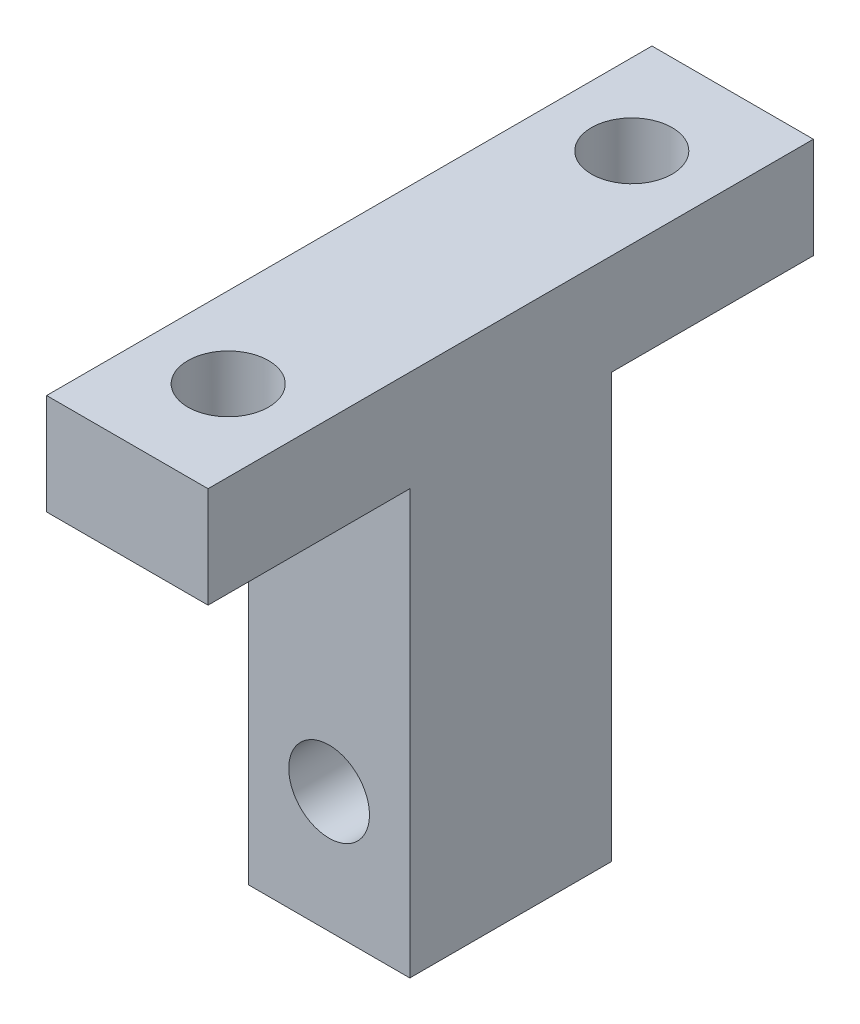
ISO-10303-21;
HEADER;
FILE_DESCRIPTION(('STEP AP214'),'2;1');
FILE_NAME('part.step','',(''),(''),'','','');
FILE_SCHEMA(('AUTOMOTIVE_DESIGN { 1 0 10303 214 1 1 1 1 }'));
ENDSEC;
DATA;
#1=APPLICATION_CONTEXT('core data for automotive mechanical design processes');
#2=APPLICATION_PROTOCOL_DEFINITION('international standard','automotive_design',2000,#1);
#3=PRODUCT_CONTEXT('',#1,'mechanical');
#4=PRODUCT('Part','Part','',(#3));
#5=PRODUCT_RELATED_PRODUCT_CATEGORY('part','',(#4));
#6=PRODUCT_DEFINITION_FORMATION('','',#4);
#7=PRODUCT_DEFINITION_CONTEXT('part definition',#1,'design');
#8=PRODUCT_DEFINITION('design','',#6,#7);
#9=PRODUCT_DEFINITION_SHAPE('','',#8);
#10=(LENGTH_UNIT() NAMED_UNIT(*) SI_UNIT(.MILLI.,.METRE.));
#11=(NAMED_UNIT(*) PLANE_ANGLE_UNIT() SI_UNIT($,.RADIAN.));
#12=(NAMED_UNIT(*) SI_UNIT($,.STERADIAN.) SOLID_ANGLE_UNIT());
#13=UNCERTAINTY_MEASURE_WITH_UNIT(LENGTH_MEASURE(1.E-05),#10,'distance_accuracy_value','');
#14=(GEOMETRIC_REPRESENTATION_CONTEXT(3) GLOBAL_UNCERTAINTY_ASSIGNED_CONTEXT((#13)) GLOBAL_UNIT_ASSIGNED_CONTEXT((#10,
#11,#12)) REPRESENTATION_CONTEXT('',''));
#15=CARTESIAN_POINT('',(0.,0.,0.));
#16=DIRECTION('',(0.,0.,1.));
#17=DIRECTION('',(1.,0.,0.));
#18=AXIS2_PLACEMENT_3D('',#15,#16,#17);
#19=CARTESIAN_POINT('',(4.,0.,15.));
#20=DIRECTION('',(0.,0.,-1.));
#21=DIRECTION('',(-1.,0.,0.));
#22=AXIS2_PLACEMENT_3D('',#19,#20,#21);
#23=PLANE('',#22);
#24=DIRECTION('',(0.,-1.,0.));
#25=VECTOR('',#24,1.);
#26=CARTESIAN_POINT('',(-4.,0.,15.));
#27=LINE('',#26,#25);
#28=CARTESIAN_POINT('',(-4.,0.,15.));
#29=VERTEX_POINT('',#28);
#30=CARTESIAN_POINT('',(-4.,-5.,15.));
#31=VERTEX_POINT('',#30);
#32=EDGE_CURVE('E138',#29,#31,#27,.T.);
#33=ORIENTED_EDGE('',*,*,#32,.T.);
#34=DIRECTION('',(-1.,0.,0.));
#35=VECTOR('',#34,1.);
#36=CARTESIAN_POINT('',(4.,-5.,15.));
#37=LINE('',#36,#35);
#38=CARTESIAN_POINT('',(4.,-5.,15.));
#39=VERTEX_POINT('',#38);
#40=EDGE_CURVE('E46',#39,#31,#37,.T.);
#41=ORIENTED_EDGE('',*,*,#40,.F.);
#42=DIRECTION('',(0.,-1.,0.));
#43=VECTOR('',#42,1.);
#44=CARTESIAN_POINT('',(4.,0.,15.));
#45=LINE('',#44,#43);
#46=CARTESIAN_POINT('',(4.,0.,15.));
#47=VERTEX_POINT('',#46);
#48=EDGE_CURVE('E98',#47,#39,#45,.T.);
#49=ORIENTED_EDGE('',*,*,#48,.F.);
#50=DIRECTION('',(-1.,0.,0.));
#51=VECTOR('',#50,1.);
#52=CARTESIAN_POINT('',(4.,0.,15.));
#53=LINE('',#52,#51);
#54=EDGE_CURVE('E11',#47,#29,#53,.T.);
#55=ORIENTED_EDGE('',*,*,#54,.T.);
#56=EDGE_LOOP('',(#33,#41,#49,#55));
#57=FACE_BOUND('',#56,.T.);
#58=ADVANCED_FACE('F37',(#57),#23,.F.);
#59=CARTESIAN_POINT('',(4.,-5.,15.));
#60=DIRECTION('',(0.,1.,0.));
#61=DIRECTION('',(0.,0.,1.));
#62=AXIS2_PLACEMENT_3D('',#59,#60,#61);
#63=PLANE('',#62);
#64=CARTESIAN_POINT('',(0.,-5.,10.));
#65=DIRECTION('',(0.,1.,0.));
#66=DIRECTION('',(0.,0.,1.));
#67=AXIS2_PLACEMENT_3D('',#64,#65,#66);
#68=CIRCLE('',#67,2.);
#69=CARTESIAN_POINT('',(0.,-5.,12.));
#70=VERTEX_POINT('',#69);
#71=EDGE_CURVE('E186',#70,#70,#68,.F.);
#72=ORIENTED_EDGE('',*,*,#71,.F.);
#73=EDGE_LOOP('',(#72));
#74=FACE_BOUND('',#73,.T.);
#75=DIRECTION('',(0.,0.,-1.));
#76=VECTOR('',#75,1.);
#77=CARTESIAN_POINT('',(-4.,-5.,15.));
#78=LINE('',#77,#76);
#79=CARTESIAN_POINT('',(-4.,-5.,5.));
#80=VERTEX_POINT('',#79);
#81=EDGE_CURVE('E140',#31,#80,#78,.T.);
#82=ORIENTED_EDGE('',*,*,#81,.T.);
#83=DIRECTION('',(-1.,0.,0.));
#84=VECTOR('',#83,1.);
#85=CARTESIAN_POINT('',(4.,-5.,5.));
#86=LINE('',#85,#84);
#87=CARTESIAN_POINT('',(4.,-5.,5.));
#88=VERTEX_POINT('',#87);
#89=EDGE_CURVE('E158',#88,#80,#86,.T.);
#90=ORIENTED_EDGE('',*,*,#89,.F.);
#91=DIRECTION('',(0.,0.,-1.));
#92=VECTOR('',#91,1.);
#93=CARTESIAN_POINT('',(4.,-5.,15.));
#94=LINE('',#93,#92);
#95=EDGE_CURVE('E167',#39,#88,#94,.T.);
#96=ORIENTED_EDGE('',*,*,#95,.F.);
#97=ORIENTED_EDGE('',*,*,#40,.T.);
#98=EDGE_LOOP('',(#82,#90,#96,#97));
#99=FACE_BOUND('',#98,.T.);
#100=ADVANCED_FACE('F165',(#74,#99),#63,.F.);
#101=CARTESIAN_POINT('',(4.,-5.,5.));
#102=DIRECTION('',(0.,0.,-1.));
#103=DIRECTION('',(0.,1.,0.));
#104=AXIS2_PLACEMENT_3D('',#101,#102,#103);
#105=PLANE('',#104);
#106=CARTESIAN_POINT('',(0.,-20.,4.99999999999999));
#107=DIRECTION('',(0.,0.,-1.));
#108=DIRECTION('',(0.,1.,0.));
#109=AXIS2_PLACEMENT_3D('',#106,#107,#108);
#110=CIRCLE('',#109,2.);
#111=CARTESIAN_POINT('',(0.,-18.,4.99999999999999));
#112=VERTEX_POINT('',#111);
#113=EDGE_CURVE('E193',#112,#112,#110,.T.);
#114=ORIENTED_EDGE('',*,*,#113,.T.);
#115=EDGE_LOOP('',(#114));
#116=FACE_BOUND('',#115,.T.);
#117=DIRECTION('',(0.,-1.,0.));
#118=VECTOR('',#117,1.);
#119=CARTESIAN_POINT('',(-4.,-5.,5.));
#120=LINE('',#119,#118);
#121=CARTESIAN_POINT('',(-4.,-26.,4.99999999999999));
#122=VERTEX_POINT('',#121);
#123=EDGE_CURVE('E143',#80,#122,#120,.T.);
#124=ORIENTED_EDGE('',*,*,#123,.T.);
#125=DIRECTION('',(-1.,0.,0.));
#126=VECTOR('',#125,1.);
#127=CARTESIAN_POINT('',(4.,-26.,4.99999999999999));
#128=LINE('',#127,#126);
#129=CARTESIAN_POINT('',(4.,-26.,4.99999999999999));
#130=VERTEX_POINT('',#129);
#131=EDGE_CURVE('E155',#130,#122,#128,.T.);
#132=ORIENTED_EDGE('',*,*,#131,.F.);
#133=DIRECTION('',(0.,-1.,0.));
#134=VECTOR('',#133,1.);
#135=CARTESIAN_POINT('',(4.,-5.,5.));
#136=LINE('',#135,#134);
#137=EDGE_CURVE('E180',#88,#130,#136,.T.);
#138=ORIENTED_EDGE('',*,*,#137,.F.);
#139=ORIENTED_EDGE('',*,*,#89,.T.);
#140=EDGE_LOOP('',(#124,#132,#138,#139));
#141=FACE_BOUND('',#140,.T.);
#142=ADVANCED_FACE('F176',(#116,#141),#105,.F.);
#143=CARTESIAN_POINT('',(4.,-26.,4.99999999999999));
#144=DIRECTION('',(0.,1.,0.));
#145=DIRECTION('',(0.,0.,1.));
#146=AXIS2_PLACEMENT_3D('',#143,#144,#145);
#147=PLANE('',#146);
#148=DIRECTION('',(0.,0.,-1.));
#149=VECTOR('',#148,1.);
#150=CARTESIAN_POINT('',(-4.,-26.,4.99999999999999));
#151=LINE('',#150,#149);
#152=CARTESIAN_POINT('',(-4.,-26.,-5.00000000000001));
#153=VERTEX_POINT('',#152);
#154=EDGE_CURVE('E145',#122,#153,#151,.T.);
#155=ORIENTED_EDGE('',*,*,#154,.T.);
#156=DIRECTION('',(-1.,0.,0.));
#157=VECTOR('',#156,1.);
#158=CARTESIAN_POINT('',(4.,-26.,-5.00000000000001));
#159=LINE('',#158,#157);
#160=CARTESIAN_POINT('',(4.,-26.,-5.00000000000001));
#161=VERTEX_POINT('',#160);
#162=EDGE_CURVE('E127',#161,#153,#159,.T.);
#163=ORIENTED_EDGE('',*,*,#162,.F.);
#164=DIRECTION('',(0.,0.,-1.));
#165=VECTOR('',#164,1.);
#166=CARTESIAN_POINT('',(4.,-26.,4.99999999999999));
#167=LINE('',#166,#165);
#168=EDGE_CURVE('E118',#130,#161,#167,.T.);
#169=ORIENTED_EDGE('',*,*,#168,.F.);
#170=ORIENTED_EDGE('',*,*,#131,.T.);
#171=EDGE_LOOP('',(#155,#163,#169,#170));
#172=FACE_BOUND('',#171,.T.);
#173=ADVANCED_FACE('F179',(#172),#147,.F.);
#174=CARTESIAN_POINT('',(4.,-5.,-5.));
#175=DIRECTION('',(0.,0.,1.));
#176=DIRECTION('',(0.,-1.,0.));
#177=AXIS2_PLACEMENT_3D('',#174,#175,#176);
#178=PLANE('',#177);
#179=CARTESIAN_POINT('',(0.,-20.,-5.));
#180=DIRECTION('',(0.,0.,1.));
#181=DIRECTION('',(0.,-1.,0.));
#182=AXIS2_PLACEMENT_3D('',#179,#180,#181);
#183=CIRCLE('',#182,2.);
#184=CARTESIAN_POINT('',(0.,-22.,-5.));
#185=VERTEX_POINT('',#184);
#186=EDGE_CURVE('E40',#185,#185,#183,.T.);
#187=ORIENTED_EDGE('',*,*,#186,.T.);
#188=EDGE_LOOP('',(#187));
#189=FACE_BOUND('',#188,.T.);
#190=DIRECTION('',(0.,1.,0.));
#191=VECTOR('',#190,1.);
#192=CARTESIAN_POINT('',(-4.,-5.,-5.));
#193=LINE('',#192,#191);
#194=CARTESIAN_POINT('',(-4.,-5.,-5.));
#195=VERTEX_POINT('',#194);
#196=EDGE_CURVE('E126',#153,#195,#193,.T.);
#197=ORIENTED_EDGE('',*,*,#196,.T.);
#198=DIRECTION('',(-1.,0.,0.));
#199=VECTOR('',#198,1.);
#200=CARTESIAN_POINT('',(4.,-5.,-5.));
#201=LINE('',#200,#199);
#202=CARTESIAN_POINT('',(4.,-5.,-5.));
#203=VERTEX_POINT('',#202);
#204=EDGE_CURVE('E123',#203,#195,#201,.T.);
#205=ORIENTED_EDGE('',*,*,#204,.F.);
#206=DIRECTION('',(0.,1.,0.));
#207=VECTOR('',#206,1.);
#208=CARTESIAN_POINT('',(4.,-5.,-5.));
#209=LINE('',#208,#207);
#210=EDGE_CURVE('E112',#161,#203,#209,.T.);
#211=ORIENTED_EDGE('',*,*,#210,.F.);
#212=ORIENTED_EDGE('',*,*,#162,.T.);
#213=EDGE_LOOP('',(#197,#205,#211,#212));
#214=FACE_BOUND('',#213,.T.);
#215=ADVANCED_FACE('F124',(#189,#214),#178,.F.);
#216=CARTESIAN_POINT('',(4.,-5.,-15.));
#217=DIRECTION('',(0.,1.,0.));
#218=DIRECTION('',(0.,0.,1.));
#219=AXIS2_PLACEMENT_3D('',#216,#217,#218);
#220=PLANE('',#219);
#221=CARTESIAN_POINT('',(0.,-5.,-10.));
#222=DIRECTION('',(0.,1.,0.));
#223=DIRECTION('',(0.,0.,1.));
#224=AXIS2_PLACEMENT_3D('',#221,#222,#223);
#225=CIRCLE('',#224,2.);
#226=CARTESIAN_POINT('',(0.,-5.,-8.));
#227=VERTEX_POINT('',#226);
#228=EDGE_CURVE('E141',#227,#227,#225,.F.);
#229=ORIENTED_EDGE('',*,*,#228,.F.);
#230=EDGE_LOOP('',(#229));
#231=FACE_BOUND('',#230,.T.);
#232=DIRECTION('',(0.,0.,-1.));
#233=VECTOR('',#232,1.);
#234=CARTESIAN_POINT('',(-4.,-5.,-15.));
#235=LINE('',#234,#233);
#236=CARTESIAN_POINT('',(-4.,-5.,-15.));
#237=VERTEX_POINT('',#236);
#238=EDGE_CURVE('E84',#195,#237,#235,.T.);
#239=ORIENTED_EDGE('',*,*,#238,.T.);
#240=DIRECTION('',(-1.,0.,0.));
#241=VECTOR('',#240,1.);
#242=CARTESIAN_POINT('',(4.,-5.,-15.));
#243=LINE('',#242,#241);
#244=CARTESIAN_POINT('',(4.,-5.,-15.));
#245=VERTEX_POINT('',#244);
#246=EDGE_CURVE('E128',#245,#237,#243,.T.);
#247=ORIENTED_EDGE('',*,*,#246,.F.);
#248=DIRECTION('',(0.,0.,-1.));
#249=VECTOR('',#248,1.);
#250=CARTESIAN_POINT('',(4.,-5.,-15.));
#251=LINE('',#250,#249);
#252=EDGE_CURVE('E116',#203,#245,#251,.T.);
#253=ORIENTED_EDGE('',*,*,#252,.F.);
#254=ORIENTED_EDGE('',*,*,#204,.T.);
#255=EDGE_LOOP('',(#239,#247,#253,#254));
#256=FACE_BOUND('',#255,.T.);
#257=ADVANCED_FACE('F130',(#231,#256),#220,.F.);
#258=CARTESIAN_POINT('',(4.,0.,-15.));
#259=DIRECTION('',(0.,0.,1.));
#260=DIRECTION('',(1.,0.,0.));
#261=AXIS2_PLACEMENT_3D('',#258,#259,#260);
#262=PLANE('',#261);
#263=DIRECTION('',(0.,1.,0.));
#264=VECTOR('',#263,1.);
#265=CARTESIAN_POINT('',(-4.,0.,-15.));
#266=LINE('',#265,#264);
#267=CARTESIAN_POINT('',(-4.,0.,-15.));
#268=VERTEX_POINT('',#267);
#269=EDGE_CURVE('E91',#237,#268,#266,.T.);
#270=ORIENTED_EDGE('',*,*,#269,.T.);
#271=DIRECTION('',(-1.,0.,0.));
#272=VECTOR('',#271,1.);
#273=CARTESIAN_POINT('',(4.,0.,-15.));
#274=LINE('',#273,#272);
#275=CARTESIAN_POINT('',(4.,0.,-15.));
#276=VERTEX_POINT('',#275);
#277=EDGE_CURVE('E134',#276,#268,#274,.T.);
#278=ORIENTED_EDGE('',*,*,#277,.F.);
#279=DIRECTION('',(0.,1.,0.));
#280=VECTOR('',#279,1.);
#281=CARTESIAN_POINT('',(4.,0.,-15.));
#282=LINE('',#281,#280);
#283=EDGE_CURVE('E132',#245,#276,#282,.T.);
#284=ORIENTED_EDGE('',*,*,#283,.F.);
#285=ORIENTED_EDGE('',*,*,#246,.T.);
#286=EDGE_LOOP('',(#270,#278,#284,#285));
#287=FACE_BOUND('',#286,.T.);
#288=ADVANCED_FACE('F222',(#287),#262,.F.);
#289=CARTESIAN_POINT('',(4.,0.,-15.));
#290=DIRECTION('',(0.,-1.,0.));
#291=DIRECTION('',(0.,0.,-1.));
#292=AXIS2_PLACEMENT_3D('',#289,#290,#291);
#293=PLANE('',#292);
#294=CARTESIAN_POINT('',(0.,0.,-10.));
#295=DIRECTION('',(0.,1.,0.));
#296=DIRECTION('',(0.,0.,1.));
#297=AXIS2_PLACEMENT_3D('',#294,#295,#296);
#298=CIRCLE('',#297,2.);
#299=CARTESIAN_POINT('',(0.,0.,-8.));
#300=VERTEX_POINT('',#299);
#301=EDGE_CURVE('E189',#300,#300,#298,.T.);
#302=ORIENTED_EDGE('',*,*,#301,.F.);
#303=EDGE_LOOP('',(#302));
#304=FACE_BOUND('',#303,.T.);
#305=CARTESIAN_POINT('',(0.,0.,10.));
#306=DIRECTION('',(0.,1.,0.));
#307=DIRECTION('',(0.,0.,-1.));
#308=AXIS2_PLACEMENT_3D('',#305,#306,#307);
#309=CIRCLE('',#308,2.);
#310=CARTESIAN_POINT('',(0.,0.,8.));
#311=VERTEX_POINT('',#310);
#312=EDGE_CURVE('E190',#311,#311,#309,.T.);
#313=ORIENTED_EDGE('',*,*,#312,.F.);
#314=EDGE_LOOP('',(#313));
#315=FACE_BOUND('',#314,.T.);
#316=DIRECTION('',(0.,0.,1.));
#317=VECTOR('',#316,1.);
#318=CARTESIAN_POINT('',(-4.,0.,-15.));
#319=LINE('',#318,#317);
#320=EDGE_CURVE('E150',#268,#29,#319,.T.);
#321=ORIENTED_EDGE('',*,*,#320,.T.);
#322=ORIENTED_EDGE('',*,*,#54,.F.);
#323=DIRECTION('',(0.,0.,1.));
#324=VECTOR('',#323,1.);
#325=CARTESIAN_POINT('',(4.,0.,15.));
#326=LINE('',#325,#324);
#327=EDGE_CURVE('E54',#276,#47,#326,.T.);
#328=ORIENTED_EDGE('',*,*,#327,.F.);
#329=ORIENTED_EDGE('',*,*,#277,.T.);
#330=EDGE_LOOP('',(#321,#322,#328,#329));
#331=FACE_BOUND('',#330,.T.);
#332=ADVANCED_FACE('F221',(#304,#315,#331),#293,.F.);
#333=CARTESIAN_POINT('',(4.,0.,0.));
#334=DIRECTION('',(-1.,0.,0.));
#335=DIRECTION('',(0.,0.,1.));
#336=AXIS2_PLACEMENT_3D('',#333,#334,#335);
#337=PLANE('',#336);
#338=ORIENTED_EDGE('',*,*,#327,.T.);
#339=ORIENTED_EDGE('',*,*,#48,.T.);
#340=ORIENTED_EDGE('',*,*,#95,.T.);
#341=ORIENTED_EDGE('',*,*,#137,.T.);
#342=ORIENTED_EDGE('',*,*,#168,.T.);
#343=ORIENTED_EDGE('',*,*,#210,.T.);
#344=ORIENTED_EDGE('',*,*,#252,.T.);
#345=ORIENTED_EDGE('',*,*,#283,.T.);
#346=EDGE_LOOP('',(#338,#339,#340,#341,#342,#343,#344,#345));
#347=FACE_BOUND('',#346,.T.);
#348=ADVANCED_FACE('F114',(#347),#337,.F.);
#349=CARTESIAN_POINT('',(-4.,0.,0.));
#350=DIRECTION('',(-1.,0.,0.));
#351=DIRECTION('',(0.,0.,1.));
#352=AXIS2_PLACEMENT_3D('',#349,#350,#351);
#353=PLANE('',#352);
#354=ORIENTED_EDGE('',*,*,#32,.F.);
#355=ORIENTED_EDGE('',*,*,#320,.F.);
#356=ORIENTED_EDGE('',*,*,#269,.F.);
#357=ORIENTED_EDGE('',*,*,#238,.F.);
#358=ORIENTED_EDGE('',*,*,#196,.F.);
#359=ORIENTED_EDGE('',*,*,#154,.F.);
#360=ORIENTED_EDGE('',*,*,#123,.F.);
#361=ORIENTED_EDGE('',*,*,#81,.F.);
#362=EDGE_LOOP('',(#354,#355,#356,#357,#358,#359,#360,#361));
#363=FACE_BOUND('',#362,.T.);
#364=ADVANCED_FACE('F171',(#363),#353,.T.);
#365=CARTESIAN_POINT('',(0.,-26.001,10.));
#366=DIRECTION('',(0.,1.,0.));
#367=DIRECTION('',(0.,0.,1.));
#368=AXIS2_PLACEMENT_3D('',#365,#366,#367);
#369=CYLINDRICAL_SURFACE('',#368,2.);
#370=ORIENTED_EDGE('',*,*,#312,.T.);
#371=EDGE_LOOP('',(#370));
#372=FACE_BOUND('',#371,.T.);
#373=ORIENTED_EDGE('',*,*,#71,.T.);
#374=EDGE_LOOP('',(#373));
#375=FACE_BOUND('',#374,.T.);
#376=ADVANCED_FACE('F213',(#372,#375),#369,.F.);
#377=CARTESIAN_POINT('',(0.,-26.001,-10.));
#378=DIRECTION('',(0.,1.,0.));
#379=DIRECTION('',(0.,0.,1.));
#380=AXIS2_PLACEMENT_3D('',#377,#378,#379);
#381=CYLINDRICAL_SURFACE('',#380,2.);
#382=ORIENTED_EDGE('',*,*,#301,.T.);
#383=EDGE_LOOP('',(#382));
#384=FACE_BOUND('',#383,.T.);
#385=ORIENTED_EDGE('',*,*,#228,.T.);
#386=EDGE_LOOP('',(#385));
#387=FACE_BOUND('',#386,.T.);
#388=ADVANCED_FACE('F208',(#384,#387),#381,.F.);
#389=CARTESIAN_POINT('',(0.,-20.,-15.));
#390=DIRECTION('',(0.,0.,1.));
#391=DIRECTION('',(1.,0.,0.));
#392=AXIS2_PLACEMENT_3D('',#389,#390,#391);
#393=CYLINDRICAL_SURFACE('',#392,2.);
#394=ORIENTED_EDGE('',*,*,#186,.F.);
#395=EDGE_LOOP('',(#394));
#396=FACE_BOUND('',#395,.T.);
#397=ORIENTED_EDGE('',*,*,#113,.F.);
#398=EDGE_LOOP('',(#397));
#399=FACE_BOUND('',#398,.T.);
#400=ADVANCED_FACE('F205',(#396,#399),#393,.F.);
#401=CLOSED_SHELL('',(#58,#100,#142,#173,#215,#257,#288,#332,#348,#364,#376,#388,#400));
#402=MANIFOLD_SOLID_BREP('B2',#401);
#403=ADVANCED_BREP_SHAPE_REPRESENTATION('',(#18,#402),#14);
#404=SHAPE_DEFINITION_REPRESENTATION(#9,#403);
ENDSEC;
END-ISO-10303-21;
